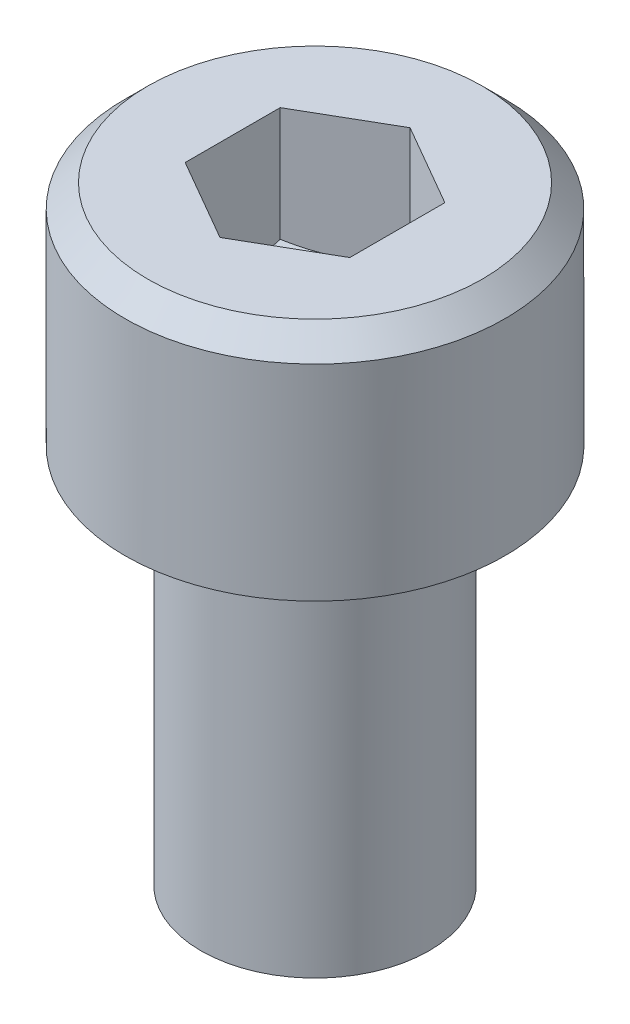
ISO-10303-21;
HEADER;
FILE_DESCRIPTION(('STEP AP214'),'2;1');
FILE_NAME('part.step','',(''),(''),'','','');
FILE_SCHEMA(('AUTOMOTIVE_DESIGN { 1 0 10303 214 1 1 1 1 }'));
ENDSEC;
DATA;
#1=APPLICATION_CONTEXT('core data for automotive mechanical design processes');
#2=APPLICATION_PROTOCOL_DEFINITION('international standard','automotive_design',2000,#1);
#3=PRODUCT_CONTEXT('',#1,'mechanical');
#4=PRODUCT('Part','Part','',(#3));
#5=PRODUCT_RELATED_PRODUCT_CATEGORY('part','',(#4));
#6=PRODUCT_DEFINITION_FORMATION('','',#4);
#7=PRODUCT_DEFINITION_CONTEXT('part definition',#1,'design');
#8=PRODUCT_DEFINITION('design','',#6,#7);
#9=PRODUCT_DEFINITION_SHAPE('','',#8);
#10=(LENGTH_UNIT() NAMED_UNIT(*) SI_UNIT(.MILLI.,.METRE.));
#11=(NAMED_UNIT(*) PLANE_ANGLE_UNIT() SI_UNIT($,.RADIAN.));
#12=(NAMED_UNIT(*) SI_UNIT($,.STERADIAN.) SOLID_ANGLE_UNIT());
#13=UNCERTAINTY_MEASURE_WITH_UNIT(LENGTH_MEASURE(1.E-05),#10,'distance_accuracy_value','');
#14=(GEOMETRIC_REPRESENTATION_CONTEXT(3) GLOBAL_UNCERTAINTY_ASSIGNED_CONTEXT((#13)) GLOBAL_UNIT_ASSIGNED_CONTEXT((#10,
#11,#12)) REPRESENTATION_CONTEXT('',''));
#15=CARTESIAN_POINT('',(0.,0.,0.));
#16=DIRECTION('',(0.,0.,1.));
#17=DIRECTION('',(1.,0.,0.));
#18=AXIS2_PLACEMENT_3D('',#15,#16,#17);
#19=CARTESIAN_POINT('',(0.,0.,0.));
#20=DIRECTION('',(0.,1.,0.));
#21=DIRECTION('',(0.,0.,1.));
#22=AXIS2_PLACEMENT_3D('',#19,#20,#21);
#23=PLANE('',#22);
#24=CARTESIAN_POINT('',(0.,0.,0.));
#25=DIRECTION('',(0.,1.,0.));
#26=DIRECTION('',(0.,0.,1.));
#27=AXIS2_PLACEMENT_3D('',#24,#25,#26);
#28=CIRCLE('',#27,5.);
#29=CARTESIAN_POINT('',(0.,0.,5.));
#30=VERTEX_POINT('',#29);
#31=EDGE_CURVE('E192',#30,#30,#28,.T.);
#32=ORIENTED_EDGE('',*,*,#31,.F.);
#33=EDGE_LOOP('',(#32));
#34=FACE_BOUND('',#33,.T.);
#35=CARTESIAN_POINT('',(0.,0.,0.));
#36=DIRECTION('',(0.,1.,0.));
#37=DIRECTION('',(0.,0.,1.));
#38=AXIS2_PLACEMENT_3D('',#35,#36,#37);
#39=CIRCLE('',#38,3.);
#40=CARTESIAN_POINT('',(0.,0.,3.));
#41=VERTEX_POINT('',#40);
#42=EDGE_CURVE('E11',#41,#41,#39,.F.);
#43=ORIENTED_EDGE('',*,*,#42,.F.);
#44=EDGE_LOOP('',(#43));
#45=FACE_BOUND('',#44,.T.);
#46=ADVANCED_FACE('F32',(#34,#45),#23,.F.);
#47=CARTESIAN_POINT('',(0.,6.,0.));
#48=DIRECTION('',(0.,1.,0.));
#49=DIRECTION('',(0.,0.,1.));
#50=AXIS2_PLACEMENT_3D('',#47,#48,#49);
#51=PLANE('',#50);
#52=CARTESIAN_POINT('',(0.,6.,0.));
#53=DIRECTION('',(0.,1.,0.));
#54=DIRECTION('',(0.,0.,1.));
#55=AXIS2_PLACEMENT_3D('',#52,#53,#54);
#56=CIRCLE('',#55,4.4);
#57=CARTESIAN_POINT('',(0.,6.,-4.40000000000001));
#58=VERTEX_POINT('',#57);
#59=EDGE_CURVE('E105',#58,#58,#56,.T.);
#60=ORIENTED_EDGE('',*,*,#59,.T.);
#61=EDGE_LOOP('',(#60));
#62=FACE_BOUND('',#61,.T.);
#63=DIRECTION('',(-0.866025403784439,0.,0.5));
#64=VECTOR('',#63,1.);
#65=CARTESIAN_POINT('',(0.,6.,-2.5));
#66=LINE('',#65,#64);
#67=CARTESIAN_POINT('',(0.,6.,-2.5));
#68=VERTEX_POINT('',#67);
#69=CARTESIAN_POINT('',(-2.1650635094611,6.,-1.25));
#70=VERTEX_POINT('',#69);
#71=EDGE_CURVE('E168',#68,#70,#66,.T.);
#72=ORIENTED_EDGE('',*,*,#71,.F.);
#73=DIRECTION('',(-0.866025403784439,0.,-0.5));
#74=VECTOR('',#73,1.);
#75=CARTESIAN_POINT('',(2.1650635094611,6.,-1.25));
#76=LINE('',#75,#74);
#77=CARTESIAN_POINT('',(2.1650635094611,6.,-1.25));
#78=VERTEX_POINT('',#77);
#79=EDGE_CURVE('E166',#78,#68,#76,.T.);
#80=ORIENTED_EDGE('',*,*,#79,.F.);
#81=DIRECTION('',(0.,0.,-1.));
#82=VECTOR('',#81,1.);
#83=CARTESIAN_POINT('',(2.1650635094611,6.,1.25));
#84=LINE('',#83,#82);
#85=CARTESIAN_POINT('',(2.1650635094611,6.,1.25));
#86=VERTEX_POINT('',#85);
#87=EDGE_CURVE('E177',#86,#78,#84,.T.);
#88=ORIENTED_EDGE('',*,*,#87,.F.);
#89=DIRECTION('',(0.866025403784439,0.,-0.5));
#90=VECTOR('',#89,1.);
#91=CARTESIAN_POINT('',(0.,6.,2.5));
#92=LINE('',#91,#90);
#93=CARTESIAN_POINT('',(0.,6.,2.5));
#94=VERTEX_POINT('',#93);
#95=EDGE_CURVE('E174',#94,#86,#92,.T.);
#96=ORIENTED_EDGE('',*,*,#95,.F.);
#97=DIRECTION('',(0.866025403784439,0.,0.5));
#98=VECTOR('',#97,1.);
#99=CARTESIAN_POINT('',(-2.1650635094611,6.,1.25));
#100=LINE('',#99,#98);
#101=CARTESIAN_POINT('',(-2.1650635094611,6.,1.25));
#102=VERTEX_POINT('',#101);
#103=EDGE_CURVE('E172',#102,#94,#100,.T.);
#104=ORIENTED_EDGE('',*,*,#103,.F.);
#105=DIRECTION('',(0.,0.,1.));
#106=VECTOR('',#105,1.);
#107=CARTESIAN_POINT('',(-2.1650635094611,6.,-1.25));
#108=LINE('',#107,#106);
#109=EDGE_CURVE('E170',#70,#102,#108,.T.);
#110=ORIENTED_EDGE('',*,*,#109,.F.);
#111=EDGE_LOOP('',(#72,#80,#88,#96,#104,#110));
#112=FACE_BOUND('',#111,.T.);
#113=ADVANCED_FACE('F160',(#62,#112),#51,.T.);
#114=CARTESIAN_POINT('',(0.,6.,0.));
#115=DIRECTION('',(0.,-1.,0.));
#116=DIRECTION('',(0.,0.,-1.));
#117=AXIS2_PLACEMENT_3D('',#114,#115,#116);
#118=CYLINDRICAL_SURFACE('',#117,5.);
#119=CARTESIAN_POINT('',(0.,5.4,0.));
#120=DIRECTION('',(0.,1.,0.));
#121=DIRECTION('',(0.,0.,1.));
#122=AXIS2_PLACEMENT_3D('',#119,#120,#121);
#123=CIRCLE('',#122,5.);
#124=CARTESIAN_POINT('',(0.,5.4,-5.));
#125=VERTEX_POINT('',#124);
#126=EDGE_CURVE('E103',#125,#125,#123,.F.);
#127=ORIENTED_EDGE('',*,*,#126,.T.);
#128=EDGE_LOOP('',(#127));
#129=FACE_BOUND('',#128,.T.);
#130=ORIENTED_EDGE('',*,*,#31,.T.);
#131=EDGE_LOOP('',(#130));
#132=FACE_BOUND('',#131,.T.);
#133=ADVANCED_FACE('F158',(#129,#132),#118,.T.);
#134=CARTESIAN_POINT('',(2.1650635094611,6.,-1.25));
#135=DIRECTION('',(-0.5,0.,0.866025403784439));
#136=DIRECTION('',(0.866025403784439,0.,0.5));
#137=AXIS2_PLACEMENT_3D('',#134,#135,#136);
#138=PLANE('',#137);
#139=CARTESIAN_POINT('',(2.1652635094611,3.00006667128526,-1.24988452994616));
#140=CARTESIAN_POINT('',(2.07011870500222,2.96833819267824,-1.30481640841249));
#141=CARTESIAN_POINT('',(1.97415261940043,2.93948196564871,-1.36022245376776));
#142=CARTESIAN_POINT('',(1.78055858450361,2.8891123686044,-1.47199402192894));
#143=CARTESIAN_POINT('',(1.68292719449887,2.86761681881919,-1.52836153122954));
#144=CARTESIAN_POINT('',(1.48887441273171,2.83415481969107,-1.6403979570198));
#145=CARTESIAN_POINT('',(1.39248288385733,2.82196568075938,-1.69604963216302));
#146=CARTESIAN_POINT('',(1.19924611203503,2.80741257411463,-1.80761493439196));
#147=CARTESIAN_POINT('',(1.10240157177295,2.80503655708809,-1.86352815578182));
#148=CARTESIAN_POINT('',(0.921431576568005,2.80997108906003,-1.96801123122864));
#149=CARTESIAN_POINT('',(0.83727907486481,2.81607004054281,-2.01659670073996));
#150=CARTESIAN_POINT('',(0.66952234238787,2.83540274952048,-2.11345109539389));
#151=CARTESIAN_POINT('',(0.58591869214993,2.84864311547626,-2.161719685364));
#152=CARTESIAN_POINT('',(0.417815884530456,2.88174403391763,-2.25877388659464));
#153=CARTESIAN_POINT('',(0.333338010712378,2.9017449447364,-2.30754720978407));
#154=CARTESIAN_POINT('',(0.165642462406327,2.9471395415079,-2.40436627974047));
#155=CARTESIAN_POINT('',(0.0824226383405094,2.97252255652845,-2.45241326756679));
#156=CARTESIAN_POINT('',(-0.00020000000000011,3.00006667128526,-2.50011547005384));
#157=B_SPLINE_CURVE_WITH_KNOTS('',3,(#139,#140,#141,#142,#143,#144,#145,#146,#147,#148,#149,
#150,#151,#152,#153,#154,#155,#156),.UNSPECIFIED.,.F.,.F.,(4,2,2,2,2,2,2,2,4),(0.,
0.343195712322223,0.687216523785883,1.02272234384043,1.3578160810825,1.64962474967976,
1.94170391412719,2.24026314832885,2.5382358827389),.UNSPECIFIED.);
#158=CARTESIAN_POINT('',(2.1650635094611,3.,-1.25));
#159=VERTEX_POINT('',#158);
#160=CARTESIAN_POINT('',(0.,3.,-2.5));
#161=VERTEX_POINT('',#160);
#162=EDGE_CURVE('E98',#159,#161,#157,.T.);
#163=ORIENTED_EDGE('',*,*,#162,.F.);
#164=DIRECTION('',(0.,-1.,0.));
#165=VECTOR('',#164,1.);
#166=CARTESIAN_POINT('',(2.1650635094611,6.,-1.25));
#167=LINE('',#166,#165);
#168=EDGE_CURVE('E179',#78,#159,#167,.T.);
#169=ORIENTED_EDGE('',*,*,#168,.F.);
#170=ORIENTED_EDGE('',*,*,#79,.T.);
#171=DIRECTION('',(0.,-1.,0.));
#172=VECTOR('',#171,1.);
#173=CARTESIAN_POINT('',(0.,6.,-2.5));
#174=LINE('',#173,#172);
#175=EDGE_CURVE('E190',#68,#161,#174,.T.);
#176=ORIENTED_EDGE('',*,*,#175,.T.);
#177=EDGE_LOOP('',(#163,#169,#170,#176));
#178=FACE_BOUND('',#177,.T.);
#179=ADVANCED_FACE('F154',(#178),#138,.T.);
#180=CARTESIAN_POINT('',(0.,6.,-2.5));
#181=DIRECTION('',(0.5,0.,0.866025403784439));
#182=DIRECTION('',(0.866025403784439,0.,-0.5));
#183=AXIS2_PLACEMENT_3D('',#180,#181,#182);
#184=PLANE('',#183);
#185=CARTESIAN_POINT('',(0.000199999999999844,3.00006667128526,-2.50011547005384));
#186=CARTESIAN_POINT('',(-0.0949448044588715,2.96833819267824,-2.44518359158751));
#187=CARTESIAN_POINT('',(-0.19091089006067,2.93948196564871,-2.38977754623224));
#188=CARTESIAN_POINT('',(-0.384504924957483,2.8891123686044,-2.27800597807106));
#189=CARTESIAN_POINT('',(-0.482136314962227,2.86761681881919,-2.22163846877046));
#190=CARTESIAN_POINT('',(-0.676189096729385,2.83415481969107,-2.1096020429802));
#191=CARTESIAN_POINT('',(-0.772580625603762,2.82196568075938,-2.05395036783698));
#192=CARTESIAN_POINT('',(-0.965817397426061,2.80741257411463,-1.94238506560804));
#193=CARTESIAN_POINT('',(-1.06266193768815,2.80503655708809,-1.88647184421818));
#194=CARTESIAN_POINT('',(-1.24363193289309,2.80997108906003,-1.78198876877136));
#195=CARTESIAN_POINT('',(-1.32778443459629,2.81607004054281,-1.73340329926004));
#196=CARTESIAN_POINT('',(-1.49554116707323,2.83540274952048,-1.63654890460611));
#197=CARTESIAN_POINT('',(-1.57914481731117,2.84864311547626,-1.588280314636));
#198=CARTESIAN_POINT('',(-1.74724762493064,2.88174403391763,-1.49122611340536));
#199=CARTESIAN_POINT('',(-1.83172549874872,2.9017449447364,-1.44245279021593));
#200=CARTESIAN_POINT('',(-1.99942104705477,2.9471395415079,-1.34563372025953));
#201=CARTESIAN_POINT('',(-2.08264087112059,2.97252255652845,-1.29758673243321));
#202=CARTESIAN_POINT('',(-2.1652635094611,3.00006667128526,-1.24988452994616));
#203=B_SPLINE_CURVE_WITH_KNOTS('',3,(#185,#186,#187,#188,#189,#190,#191,#192,#193,#194,#195,
#196,#197,#198,#199,#200,#201,#202),.UNSPECIFIED.,.F.,.F.,(4,2,2,2,2,2,2,2,4),(0.,
0.343195712322224,0.687216523785883,1.02272234384043,1.3578160810825,1.64962474967976,
1.94170391412719,2.24026314832885,2.5382358827389),.UNSPECIFIED.);
#204=CARTESIAN_POINT('',(-2.1650635094611,3.,-1.25));
#205=VERTEX_POINT('',#204);
#206=EDGE_CURVE('E47',#161,#205,#203,.T.);
#207=ORIENTED_EDGE('',*,*,#206,.F.);
#208=ORIENTED_EDGE('',*,*,#175,.F.);
#209=ORIENTED_EDGE('',*,*,#71,.T.);
#210=DIRECTION('',(0.,-1.,0.));
#211=VECTOR('',#210,1.);
#212=CARTESIAN_POINT('',(-2.1650635094611,6.,-1.25));
#213=LINE('',#212,#211);
#214=EDGE_CURVE('E188',#70,#205,#213,.T.);
#215=ORIENTED_EDGE('',*,*,#214,.T.);
#216=EDGE_LOOP('',(#207,#208,#209,#215));
#217=FACE_BOUND('',#216,.T.);
#218=ADVANCED_FACE('F150',(#217),#184,.T.);
#219=CARTESIAN_POINT('',(-2.1650635094611,6.,-1.25));
#220=DIRECTION('',(1.,0.,0.));
#221=DIRECTION('',(0.,0.,-1.));
#222=AXIS2_PLACEMENT_3D('',#219,#220,#221);
#223=PLANE('',#222);
#224=CARTESIAN_POINT('',(-2.1650635094611,3.8050470157385,-3.23708414492925));
#225=CARTESIAN_POINT('',(-2.1650635094611,3.76019170119658,-3.14358924619769));
#226=CARTESIAN_POINT('',(-2.1650635094611,3.71580228980288,-3.04986658111535));
#227=CARTESIAN_POINT('',(-2.1650635094611,3.62821957234331,-2.86184432477892));
#228=CARTESIAN_POINT('',(-2.1650635094611,3.58502648153564,-2.76754463337769));
#229=CARTESIAN_POINT('',(-2.1650635094611,3.49985940523741,-2.57770624397834));
#230=CARTESIAN_POINT('',(-2.1650635094611,3.45789440424991,-2.48216350004785));
#231=CARTESIAN_POINT('',(-2.1650635094611,3.37584621791638,-2.29027628003223));
#232=CARTESIAN_POINT('',(-2.1650635094611,3.33576293472415,-2.19393184594103));
#233=CARTESIAN_POINT('',(-2.1650635094611,3.2569585798419,-1.99775010772757));
#234=CARTESIAN_POINT('',(-2.1650635094611,3.21830052483963,-1.89788734084511));
#235=CARTESIAN_POINT('',(-2.1650635094611,3.14419847757395,-1.69695389064301));
#236=CARTESIAN_POINT('',(-2.1650635094611,3.10875485809403,-1.5958830687576));
#237=CARTESIAN_POINT('',(-2.1650635094611,3.04209525316469,-1.39260616192185));
#238=CARTESIAN_POINT('',(-2.1650635094611,3.01086949074224,-1.29040331799011));
#239=CARTESIAN_POINT('',(-2.1650635094611,2.95371347361438,-1.08453290243394));
#240=CARTESIAN_POINT('',(-2.1650635094611,2.92778190373159,-0.980865701441996));
#241=CARTESIAN_POINT('',(-2.1650635094611,2.88259661913837,-0.772282519162552));
#242=CARTESIAN_POINT('',(-2.1650635094611,2.86332918899182,-0.667369567919644));
#243=CARTESIAN_POINT('',(-2.1650635094611,2.83273384836688,-0.45636991372647));
#244=CARTESIAN_POINT('',(-2.1650635094611,2.82140540135738,-0.350283290587421));
#245=CARTESIAN_POINT('',(-2.1650635094611,2.807739084969,-0.138794772024842));
#246=CARTESIAN_POINT('',(-2.1650635094611,2.80529512070882,-0.033399902060047));
#247=CARTESIAN_POINT('',(-2.1650635094611,2.8093321989404,0.177225094551277));
#248=CARTESIAN_POINT('',(-2.1650635094611,2.81581379406952,0.282455210592975));
#249=CARTESIAN_POINT('',(-2.1650635094611,2.83432814879285,0.464666370273275));
#250=CARTESIAN_POINT('',(-2.1650635094611,2.84446946396863,0.54184888113423));
#251=CARTESIAN_POINT('',(-2.1650635094611,2.86885622129278,0.695568470988226));
#252=CARTESIAN_POINT('',(-2.1650635094611,2.88310237358499,0.77210543594052));
#253=CARTESIAN_POINT('',(-2.1650635094611,2.9312446294425,1.00070856673805));
#254=CARTESIAN_POINT('',(-2.1650635094611,2.97053094175,1.15164790005744));
#255=CARTESIAN_POINT('',(-2.1650635094611,3.03764968374044,1.37734752229313));
#256=CARTESIAN_POINT('',(-2.1650635094611,3.06170057056914,1.45329756023634));
#257=CARTESIAN_POINT('',(-2.1650635094611,3.11202648600941,1.6044114117336));
#258=CARTESIAN_POINT('',(-2.1650635094611,3.13830012658181,1.6795756834982));
#259=CARTESIAN_POINT('',(-2.1650635094611,3.19269084911368,1.82921284791554));
#260=CARTESIAN_POINT('',(-2.1650635094611,3.22080759605596,1.90368586342235));
#261=CARTESIAN_POINT('',(-2.1650635094611,3.27857997694148,2.05204546399224));
#262=CARTESIAN_POINT('',(-2.1650635094611,3.30823587088568,2.12593194752876));
#263=CARTESIAN_POINT('',(-2.1650635094611,3.38583420486507,2.31452960100078));
#264=CARTESIAN_POINT('',(-2.1650635094611,3.43469265937545,2.4288633910483));
#265=CARTESIAN_POINT('',(-2.1650635094611,3.53476008521725,2.65650089899962));
#266=CARTESIAN_POINT('',(-2.1650635094611,3.58596923263417,2.76980453897289));
#267=CARTESIAN_POINT('',(-2.1650635094611,3.69020422865822,2.99559474057868));
#268=CARTESIAN_POINT('',(-2.1650635094611,3.74323039241037,3.10808115632852));
#269=CARTESIAN_POINT('',(-2.1650635094611,3.85069884055655,3.33237654093382));
#270=CARTESIAN_POINT('',(-2.1650635094611,3.90514115644306,3.44418549465555));
#271=CARTESIAN_POINT('',(-2.1650635094611,4.07026614546233,3.77905713863866));
#272=CARTESIAN_POINT('',(-2.1650635094611,4.1826204263763,4.00129477654562));
#273=CARTESIAN_POINT('',(-2.1650635094611,4.41020240940515,4.4442484067733));
#274=CARTESIAN_POINT('',(-2.1650635094611,4.5254297462725,4.6649645880066));
#275=CARTESIAN_POINT('',(-2.1650635094611,4.74690853801413,5.08455999937498));
#276=CARTESIAN_POINT('',(-2.1650635094611,4.85298066526274,5.28353403787829));
#277=CARTESIAN_POINT('',(-2.1650635094611,5.06633256058658,5.68084213525983));
#278=CARTESIAN_POINT('',(-2.1650635094611,5.17361237335311,5.8791761701025));
#279=CARTESIAN_POINT('',(-2.1650635094611,5.38880369894564,6.27484726366277));
#280=CARTESIAN_POINT('',(-2.1650635094611,5.49671291098079,6.4721855750882));
#281=CARTESIAN_POINT('',(-2.1650635094611,5.7132336678127,6.86646322697264));
#282=CARTESIAN_POINT('',(-2.1650635094611,5.82184517555931,7.06340258777024));
#283=CARTESIAN_POINT('',(-2.1650635094611,5.93071410034849,7.26019862230059));
#284=B_SPLINE_CURVE_WITH_KNOTS('',3,(#224,#225,#226,#227,#228,#229,#230,#231,#232,#233,#234,
#235,#236,#237,#238,#239,#240,#241,#242,#243,#244,#245,#246,#247,#248,#249,#250,#251,#252,#253,
#254,#255,#256,#257,#258,#259,#260,#261,#262,#263,#264,#265,#266,#267,#268,#269,#270,#271,#272,
#273,#274,#275,#276,#277,#278,#279,#280,#281,#282,#283),.UNSPECIFIED.,.F.,.F.,(4,2,2,2,2,2,2,2,
2,2,2,2,2,2,2,2,2,2,2,2,2,2,2,2,2,2,2,2,2,4),(0.,0.311098713251637,0.622253044654453,
0.935294849275752,1.24832035817144,1.5695301269944,1.89077709954666,2.21126615366055,
2.53167549510638,2.85142142389698,3.17114574158382,3.48703926234269,3.80295234292973,
4.03637471213289,4.26983748807656,4.73712097600417,4.97610553629175,5.21494194459027,
5.45373505988453,5.69256864552432,6.06553756646348,6.43853447146568,6.81159640015035,
7.18466663211541,7.93170086903874,8.67864061595761,9.35507985472366,10.0315442084563,
10.7062879598375,11.3809964003824),.UNSPECIFIED.);
#285=CARTESIAN_POINT('',(-2.1650635094611,3.,1.25));
#286=VERTEX_POINT('',#285);
#287=EDGE_CURVE('E55',#205,#286,#284,.T.);
#288=ORIENTED_EDGE('',*,*,#287,.F.);
#289=ORIENTED_EDGE('',*,*,#214,.F.);
#290=ORIENTED_EDGE('',*,*,#109,.T.);
#291=DIRECTION('',(0.,-1.,0.));
#292=VECTOR('',#291,1.);
#293=CARTESIAN_POINT('',(-2.1650635094611,6.,1.25));
#294=LINE('',#293,#292);
#295=EDGE_CURVE('E186',#102,#286,#294,.T.);
#296=ORIENTED_EDGE('',*,*,#295,.T.);
#297=EDGE_LOOP('',(#288,#289,#290,#296));
#298=FACE_BOUND('',#297,.T.);
#299=ADVANCED_FACE('F147',(#298),#223,.T.);
#300=CARTESIAN_POINT('',(-2.1650635094611,6.,1.25));
#301=DIRECTION('',(0.5,0.,-0.866025403784439));
#302=DIRECTION('',(-0.866025403784439,0.,-0.5));
#303=AXIS2_PLACEMENT_3D('',#300,#301,#302);
#304=PLANE('',#303);
#305=CARTESIAN_POINT('',(-2.1652635094611,3.00006667128526,1.24988452994616));
#306=CARTESIAN_POINT('',(-2.07011870500222,2.96833819267824,1.30481640841249));
#307=CARTESIAN_POINT('',(-1.97415261940043,2.93948196564871,1.36022245376776));
#308=CARTESIAN_POINT('',(-1.78055858450361,2.8891123686044,1.47199402192894));
#309=CARTESIAN_POINT('',(-1.68292719449887,2.86761681881919,1.52836153122954));
#310=CARTESIAN_POINT('',(-1.48887441273171,2.83415481969107,1.6403979570198));
#311=CARTESIAN_POINT('',(-1.39248288385733,2.82196568075938,1.69604963216302));
#312=CARTESIAN_POINT('',(-1.19924611203504,2.80741257411463,1.80761493439196));
#313=CARTESIAN_POINT('',(-1.10240157177295,2.80503655708809,1.86352815578182));
#314=CARTESIAN_POINT('',(-0.921431576568005,2.80997108906003,1.96801123122864));
#315=CARTESIAN_POINT('',(-0.837279074864811,2.81607004054281,2.01659670073996));
#316=CARTESIAN_POINT('',(-0.669522342387871,2.83540274952048,2.11345109539389));
#317=CARTESIAN_POINT('',(-0.58591869214993,2.84864311547625,2.161719685364));
#318=CARTESIAN_POINT('',(-0.417815884530456,2.88174403391763,2.25877388659464));
#319=CARTESIAN_POINT('',(-0.333338010712378,2.9017449447364,2.30754720978407));
#320=CARTESIAN_POINT('',(-0.165642462406328,2.9471395415079,2.40436627974047));
#321=CARTESIAN_POINT('',(-0.0824226383405094,2.97252255652845,2.45241326756679));
#322=CARTESIAN_POINT('',(0.000199999999999981,3.00006667128526,2.50011547005384));
#323=B_SPLINE_CURVE_WITH_KNOTS('',3,(#305,#306,#307,#308,#309,#310,#311,#312,#313,#314,#315,
#316,#317,#318,#319,#320,#321,#322),.UNSPECIFIED.,.F.,.F.,(4,2,2,2,2,2,2,2,4),(0.,
0.343195712322224,0.687216523785883,1.02272234384044,1.3578160810825,1.64962474967976,
1.94170391412719,2.24026314832885,2.5382358827389),.UNSPECIFIED.);
#324=CARTESIAN_POINT('',(0.,3.,2.5));
#325=VERTEX_POINT('',#324);
#326=EDGE_CURVE('E132',#286,#325,#323,.T.);
#327=ORIENTED_EDGE('',*,*,#326,.F.);
#328=ORIENTED_EDGE('',*,*,#295,.F.);
#329=ORIENTED_EDGE('',*,*,#103,.T.);
#330=DIRECTION('',(0.,-1.,0.));
#331=VECTOR('',#330,1.);
#332=CARTESIAN_POINT('',(0.,6.,2.5));
#333=LINE('',#332,#331);
#334=EDGE_CURVE('E183',#94,#325,#333,.T.);
#335=ORIENTED_EDGE('',*,*,#334,.T.);
#336=EDGE_LOOP('',(#327,#328,#329,#335));
#337=FACE_BOUND('',#336,.T.);
#338=ADVANCED_FACE('F122',(#337),#304,.T.);
#339=CARTESIAN_POINT('',(0.,6.,2.5));
#340=DIRECTION('',(-0.5,0.,-0.866025403784439));
#341=DIRECTION('',(-0.866025403784439,0.,0.5));
#342=AXIS2_PLACEMENT_3D('',#339,#340,#341);
#343=PLANE('',#342);
#344=CARTESIAN_POINT('',(-0.000200000000000197,3.00006667128526,2.50011547005384));
#345=CARTESIAN_POINT('',(0.0949448044588709,2.96833819267824,2.44518359158751));
#346=CARTESIAN_POINT('',(0.190910890060669,2.93948196564871,2.38977754623224));
#347=CARTESIAN_POINT('',(0.384504924957482,2.8891123686044,2.27800597807106));
#348=CARTESIAN_POINT('',(0.482136314962227,2.86761681881919,2.22163846877046));
#349=CARTESIAN_POINT('',(0.676189096729384,2.83415481969107,2.1096020429802));
#350=CARTESIAN_POINT('',(0.772580625603762,2.82196568075938,2.05395036783698));
#351=CARTESIAN_POINT('',(0.965817397426061,2.80741257411463,1.94238506560804));
#352=CARTESIAN_POINT('',(1.06266193768815,2.80503655708809,1.88647184421818));
#353=CARTESIAN_POINT('',(1.24363193289309,2.80997108906003,1.78198876877136));
#354=CARTESIAN_POINT('',(1.32778443459629,2.81607004054281,1.73340329926004));
#355=CARTESIAN_POINT('',(1.49554116707323,2.83540274952048,1.63654890460611));
#356=CARTESIAN_POINT('',(1.57914481731117,2.84864311547626,1.588280314636));
#357=CARTESIAN_POINT('',(1.74724762493064,2.88174403391763,1.49122611340536));
#358=CARTESIAN_POINT('',(1.83172549874872,2.9017449447364,1.44245279021593));
#359=CARTESIAN_POINT('',(1.99942104705477,2.9471395415079,1.34563372025953));
#360=CARTESIAN_POINT('',(2.08264087112059,2.97252255652845,1.29758673243321));
#361=CARTESIAN_POINT('',(2.1652635094611,3.00006667128526,1.24988452994616));
#362=B_SPLINE_CURVE_WITH_KNOTS('',3,(#344,#345,#346,#347,#348,#349,#350,#351,#352,#353,#354,
#355,#356,#357,#358,#359,#360,#361),.UNSPECIFIED.,.F.,.F.,(4,2,2,2,2,2,2,2,4),(0.,
0.343195712322224,0.687216523785883,1.02272234384044,1.3578160810825,1.64962474967976,
1.94170391412719,2.24026314832885,2.5382358827389),.UNSPECIFIED.);
#363=CARTESIAN_POINT('',(2.1650635094611,3.,1.25));
#364=VERTEX_POINT('',#363);
#365=EDGE_CURVE('E100',#325,#364,#362,.T.);
#366=ORIENTED_EDGE('',*,*,#365,.F.);
#367=ORIENTED_EDGE('',*,*,#334,.F.);
#368=ORIENTED_EDGE('',*,*,#95,.T.);
#369=DIRECTION('',(0.,-1.,0.));
#370=VECTOR('',#369,1.);
#371=CARTESIAN_POINT('',(2.1650635094611,6.,1.25));
#372=LINE('',#371,#370);
#373=EDGE_CURVE('E181',#86,#364,#372,.T.);
#374=ORIENTED_EDGE('',*,*,#373,.T.);
#375=EDGE_LOOP('',(#366,#367,#368,#374));
#376=FACE_BOUND('',#375,.T.);
#377=ADVANCED_FACE('F118',(#376),#343,.T.);
#378=CARTESIAN_POINT('',(2.1650635094611,6.,1.25));
#379=DIRECTION('',(-1.,0.,0.));
#380=DIRECTION('',(0.,0.,1.));
#381=AXIS2_PLACEMENT_3D('',#378,#379,#380);
#382=PLANE('',#381);
#383=CARTESIAN_POINT('',(2.1650635094611,3.80504701517975,-3.23708414376496));
#384=CARTESIAN_POINT('',(2.1650635094611,3.7601917006619,-3.14358924507318));
#385=CARTESIAN_POINT('',(2.1650635094611,3.71580228929226,-3.04986658003067));
#386=CARTESIAN_POINT('',(2.1650635094611,3.62821957188067,-2.86184432377402));
#387=CARTESIAN_POINT('',(2.1650635094611,3.58502648109692,-2.76754463241276));
#388=CARTESIAN_POINT('',(2.1650635094611,3.49985940484656,-2.5777062430941));
#389=CARTESIAN_POINT('',(2.1650635094611,3.45789440388301,-2.48216349920434));
#390=CARTESIAN_POINT('',(2.1650635094611,3.37584621759691,-2.2902762792705));
#391=CARTESIAN_POINT('',(2.1650635094611,3.33576293442815,-2.19393184522035));
#392=CARTESIAN_POINT('',(2.1650635094611,3.25695857959301,-1.99775010709137));
#393=CARTESIAN_POINT('',(2.1650635094611,3.21830052461434,-1.89788734025237));
#394=CARTESIAN_POINT('',(2.1650635094611,3.14419847739439,-1.69695389013796));
#395=CARTESIAN_POINT('',(2.1650635094611,3.10875485793662,-1.59588306829678));
#396=CARTESIAN_POINT('',(2.1650635094611,3.04209525304914,-1.39260616155032));
#397=CARTESIAN_POINT('',(2.1650635094611,3.0108694906464,-1.29040331766364));
#398=CARTESIAN_POINT('',(2.1650635094611,2.95371347355431,-1.08453290219886));
#399=CARTESIAN_POINT('',(2.1650635094611,2.92778190368756,-0.980865701253249));
#400=CARTESIAN_POINT('',(2.1650635094611,2.88259661912381,-0.772282519080866));
#401=CARTESIAN_POINT('',(2.1650635094611,2.86332918898986,-0.667369567898863));
#402=CARTESIAN_POINT('',(2.1650635094611,2.83273384838067,-0.456369913828776));
#403=CARTESIAN_POINT('',(2.1650635094611,2.82140540137432,-0.350283290751908));
#404=CARTESIAN_POINT('',(2.1650635094611,2.80773908498135,-0.138794772312532));
#405=CARTESIAN_POINT('',(2.1650635094611,2.8052951207136,-0.0333999024087556));
#406=CARTESIAN_POINT('',(2.1650635094611,2.80933219891993,0.177225094081675));
#407=CARTESIAN_POINT('',(2.1650635094611,2.81581379403136,0.282455210063497));
#408=CARTESIAN_POINT('',(2.1650635094611,2.83432814871952,0.464666369665743));
#409=CARTESIAN_POINT('',(2.1650635094611,2.84446946388102,0.541848880507875));
#410=CARTESIAN_POINT('',(2.1650635094611,2.86885622117581,0.695568470324979));
#411=CARTESIAN_POINT('',(2.1650635094611,2.88310237345295,0.772105435259202));
#412=CARTESIAN_POINT('',(2.1650635094611,2.93124462926483,1.00070856600332));
#413=CARTESIAN_POINT('',(2.1650635094611,2.97053094154144,1.1516478992883));
#414=CARTESIAN_POINT('',(2.1650635094611,3.03764968348607,1.3773475214724));
#415=CARTESIAN_POINT('',(2.1650635094611,3.06170057029937,1.45329755939808));
#416=CARTESIAN_POINT('',(2.1650635094611,3.11202648570923,1.60441141086046));
#417=CARTESIAN_POINT('',(2.1650635094611,3.13830012626662,1.6795756826077));
#418=CARTESIAN_POINT('',(2.1650635094611,3.19269084876891,1.82921284699041));
#419=CARTESIAN_POINT('',(2.1650635094611,3.22080759569662,1.90368586247996));
#420=CARTESIAN_POINT('',(2.1650635094611,3.27857997655341,2.05204546301529));
#421=CARTESIAN_POINT('',(2.1650635094611,3.30823587048345,2.12593194653453));
#422=CARTESIAN_POINT('',(2.1650635094611,3.38583420444056,2.3145295999951));
#423=CARTESIAN_POINT('',(2.1650635094611,3.43469265894398,2.42886339004804));
#424=CARTESIAN_POINT('',(2.1650635094611,3.53476008477379,2.65650089800953));
#425=CARTESIAN_POINT('',(2.1650635094611,3.58596923218569,2.76980453798755));
#426=CARTESIAN_POINT('',(2.1650635094611,3.6902042282011,2.99559473960234));
#427=CARTESIAN_POINT('',(2.1650635094611,3.74323039194965,3.10808115535644));
#428=CARTESIAN_POINT('',(2.1650635094611,3.85069884008964,3.33237653996981));
#429=CARTESIAN_POINT('',(2.1650635094611,3.90514115597357,3.44418549369536));
#430=CARTESIAN_POINT('',(2.1650635094611,4.0702661449864,3.7790571376898));
#431=CARTESIAN_POINT('',(2.1650635094611,4.18262042589765,4.00129477560376));
#432=CARTESIAN_POINT('',(2.1650635094611,4.41020240892275,4.44424840584453));
#433=CARTESIAN_POINT('',(2.1650635094611,4.52542974578907,4.66496458708394));
#434=CARTESIAN_POINT('',(2.1650635094611,4.74690853752681,5.08455999845788));
#435=CARTESIAN_POINT('',(2.1650635094611,4.85298066477242,5.28353403696071));
#436=CARTESIAN_POINT('',(2.1650635094611,5.06633256009079,5.68084213434104));
#437=CARTESIAN_POINT('',(2.1650635094611,5.17361237285485,5.87917616918298));
#438=CARTESIAN_POINT('',(2.1650635094611,5.38880369844244,6.27484726274091));
#439=CARTESIAN_POINT('',(2.1650635094611,5.49671291047511,6.47218557416474));
#440=CARTESIAN_POINT('',(2.1650635094611,5.71323366730232,6.86646322604583));
#441=CARTESIAN_POINT('',(2.1650635094611,5.8218451750467,7.06340258684168));
#442=CARTESIAN_POINT('',(2.1650635094611,5.93071409983375,7.26019862137022));
#443=B_SPLINE_CURVE_WITH_KNOTS('',3,(#383,#384,#385,#386,#387,#388,#389,#390,#391,#392,#393,
#394,#395,#396,#397,#398,#399,#400,#401,#402,#403,#404,#405,#406,#407,#408,#409,#410,#411,#412,
#413,#414,#415,#416,#417,#418,#419,#420,#421,#422,#423,#424,#425,#426,#427,#428,#429,#430,#431,
#432,#433,#434,#435,#436,#437,#438,#439,#440,#441,#442),.UNSPECIFIED.,.F.,.F.,(4,2,2,2,2,2,2,2,
2,2,2,2,2,2,2,2,2,2,2,2,2,2,2,2,2,2,2,2,2,4),(0.,0.311098713112778,0.622253044376707,
0.935294848857242,1.24832035761218,1.56953012628802,1.89077709869312,2.21126615266055,
2.53167549396003,2.85142142256452,3.17114574006551,3.48703926064258,3.80295234104766,
4.03637471018926,4.26983748607137,4.73712097387555,4.97610553409904,5.21494194233353,
5.45373505756386,5.69256864313972,6.06553756408557,6.43853446909451,6.81159639778609,
7.18466662975807,7.93170086669639,8.67864061363007,9.35507985239061,10.0315442061178,
10.7062879574912,11.3809963980282),.UNSPECIFIED.);
#444=EDGE_CURVE('E40',#364,#159,#443,.F.);
#445=ORIENTED_EDGE('',*,*,#444,.F.);
#446=ORIENTED_EDGE('',*,*,#373,.F.);
#447=ORIENTED_EDGE('',*,*,#87,.T.);
#448=ORIENTED_EDGE('',*,*,#168,.T.);
#449=EDGE_LOOP('',(#445,#446,#447,#448));
#450=FACE_BOUND('',#449,.T.);
#451=ADVANCED_FACE('F114',(#450),#382,.T.);
#452=CARTESIAN_POINT('',(0.,6.,0.));
#453=DIRECTION('',(0.,-1.,0.));
#454=DIRECTION('',(0.,0.,-1.));
#455=AXIS2_PLACEMENT_3D('',#452,#453,#454);
#456=CONICAL_SURFACE('',#455,4.4,0.785398163397447);
#457=CARTESIAN_POINT('',(0.,5.4,-5.));
#458=CARTESIAN_POINT('',(0.,5.40625,-4.99375));
#459=CARTESIAN_POINT('',(0.,5.4125,-4.9875));
#460=CARTESIAN_POINT('',(0.,5.425,-4.975));
#461=CARTESIAN_POINT('',(0.,5.43125,-4.96875));
#462=CARTESIAN_POINT('',(0.,5.44375,-4.95625));
#463=CARTESIAN_POINT('',(0.,5.45,-4.95));
#464=CARTESIAN_POINT('',(0.,5.4625,-4.9375));
#465=CARTESIAN_POINT('',(0.,5.46875,-4.93125));
#466=CARTESIAN_POINT('',(0.,5.48125,-4.91875));
#467=CARTESIAN_POINT('',(0.,5.4875,-4.9125));
#468=CARTESIAN_POINT('',(0.,5.5,-4.9));
#469=CARTESIAN_POINT('',(0.,5.50625,-4.89375));
#470=CARTESIAN_POINT('',(0.,5.51875,-4.88125));
#471=CARTESIAN_POINT('',(0.,5.525,-4.875));
#472=CARTESIAN_POINT('',(0.,5.5375,-4.8625));
#473=CARTESIAN_POINT('',(0.,5.54375,-4.85625));
#474=CARTESIAN_POINT('',(0.,5.55625,-4.84375));
#475=CARTESIAN_POINT('',(0.,5.5625,-4.8375));
#476=CARTESIAN_POINT('',(0.,5.575,-4.825));
#477=CARTESIAN_POINT('',(0.,5.58125,-4.81875));
#478=CARTESIAN_POINT('',(0.,5.59375,-4.80625));
#479=CARTESIAN_POINT('',(0.,5.6,-4.8));
#480=CARTESIAN_POINT('',(0.,5.6125,-4.7875));
#481=CARTESIAN_POINT('',(0.,5.61875,-4.78125));
#482=CARTESIAN_POINT('',(0.,5.63125,-4.76875));
#483=CARTESIAN_POINT('',(0.,5.6375,-4.7625));
#484=CARTESIAN_POINT('',(0.,5.65,-4.75));
#485=CARTESIAN_POINT('',(0.,5.65625,-4.74375));
#486=CARTESIAN_POINT('',(0.,5.66875,-4.73125));
#487=CARTESIAN_POINT('',(0.,5.675,-4.725));
#488=CARTESIAN_POINT('',(0.,5.6875,-4.7125));
#489=CARTESIAN_POINT('',(0.,5.69375,-4.70625));
#490=CARTESIAN_POINT('',(0.,5.70625,-4.69375));
#491=CARTESIAN_POINT('',(0.,5.7125,-4.6875));
#492=CARTESIAN_POINT('',(0.,5.725,-4.675));
#493=CARTESIAN_POINT('',(0.,5.73125,-4.66875));
#494=CARTESIAN_POINT('',(0.,5.74375,-4.65625));
#495=CARTESIAN_POINT('',(0.,5.75,-4.65));
#496=CARTESIAN_POINT('',(0.,5.7625,-4.6375));
#497=CARTESIAN_POINT('',(0.,5.76875,-4.63125));
#498=CARTESIAN_POINT('',(0.,5.78125,-4.61875));
#499=CARTESIAN_POINT('',(0.,5.7875,-4.6125));
#500=CARTESIAN_POINT('',(0.,5.8,-4.6));
#501=CARTESIAN_POINT('',(0.,5.80625,-4.59375));
#502=CARTESIAN_POINT('',(0.,5.81875,-4.58125));
#503=CARTESIAN_POINT('',(0.,5.825,-4.575));
#504=CARTESIAN_POINT('',(0.,5.8375,-4.5625));
#505=CARTESIAN_POINT('',(0.,5.84375,-4.55625));
#506=CARTESIAN_POINT('',(0.,5.85625,-4.54375));
#507=CARTESIAN_POINT('',(0.,5.8625,-4.5375));
#508=CARTESIAN_POINT('',(0.,5.875,-4.525));
#509=CARTESIAN_POINT('',(0.,5.88125,-4.51875));
#510=CARTESIAN_POINT('',(0.,5.89375,-4.50625));
#511=CARTESIAN_POINT('',(0.,5.9,-4.5));
#512=CARTESIAN_POINT('',(0.,5.9125,-4.4875));
#513=CARTESIAN_POINT('',(0.,5.91875,-4.48125));
#514=CARTESIAN_POINT('',(0.,5.93125,-4.46875));
#515=CARTESIAN_POINT('',(0.,5.9375,-4.4625));
#516=CARTESIAN_POINT('',(0.,5.95,-4.45));
#517=CARTESIAN_POINT('',(0.,5.95625,-4.44375));
#518=CARTESIAN_POINT('',(0.,5.96875,-4.43125));
#519=CARTESIAN_POINT('',(0.,5.975,-4.42500000000001));
#520=CARTESIAN_POINT('',(0.,5.9875,-4.4125));
#521=CARTESIAN_POINT('',(0.,5.99375,-4.40625));
#522=CARTESIAN_POINT('',(0.,6.,-4.4));
#523=B_SPLINE_CURVE_WITH_KNOTS('',3,(#457,#458,#459,#460,#461,#462,#463,#464,#465,#466,#467,
#468,#469,#470,#471,#472,#473,#474,#475,#476,#477,#478,#479,#480,#481,#482,#483,#484,#485,#486,
#487,#488,#489,#490,#491,#492,#493,#494,#495,#496,#497,#498,#499,#500,#501,#502,#503,#504,#505,
#506,#507,#508,#509,#510,#511,#512,#513,#514,#515,#516,#517,#518,#519,#520,#521,#522),
.UNSPECIFIED.,.F.,.F.,(4,2,2,2,2,2,2,2,2,2,2,2,2,2,2,2,2,2,2,2,2,2,2,2,2,2,2,2,2,2,2,2,4),(0.,
0.0265165042944951,0.0530330085889901,0.0795495128834858,0.106066017177981,0.132582521472477,
0.159099025766972,0.185615530061467,0.212132034355962,0.238648538650457,0.265165042944953,
0.291681547239449,0.318198051533944,0.344714555828439,0.371231060122935,0.39774756441743,
0.424264068711925,0.45078057300642,0.477297077300916,0.503813581595412,0.530330085889907,
0.556846590184402,0.583363094478898,0.609879598773393,0.636396103067888,0.662912607362384,
0.689429111656879,0.715945615951374,0.74246212024587,0.768978624540365,0.79549512883486,
0.822011633129355,0.848528137423852),.UNSPECIFIED.);
#524=EDGE_CURVE('BSEAM34',#125,#58,#523,.T.);
#525=ORIENTED_EDGE('',*,*,#126,.F.);
#526=ORIENTED_EDGE('',*,*,#59,.F.);
#527=ORIENTED_EDGE('',*,*,#524,.T.);
#528=ORIENTED_EDGE('',*,*,#524,.F.);
#529=EDGE_LOOP('',(#525,#527,#526,#528));
#530=FACE_BOUND('',#529,.T.);
#531=ADVANCED_FACE('F34',(#530),#456,.T.);
#532=CARTESIAN_POINT('',(0.,3.,0.));
#533=DIRECTION('',(0.,1.,0.));
#534=DIRECTION('',(-1.,0.,0.));
#535=AXIS2_PLACEMENT_3D('',#532,#533,#534);
#536=CONICAL_SURFACE('',#535,2.5,1.0471975511966);
#537=CARTESIAN_POINT('',(0.,1.55662432702594,0.));
#538=VERTEX_POINT('',#537);
#539=VERTEX_LOOP('',#538);
#540=FACE_BOUND('',#539,.T.);
#541=ORIENTED_EDGE('',*,*,#444,.T.);
#542=ORIENTED_EDGE('',*,*,#162,.T.);
#543=ORIENTED_EDGE('',*,*,#206,.T.);
#544=ORIENTED_EDGE('',*,*,#287,.T.);
#545=ORIENTED_EDGE('',*,*,#326,.T.);
#546=ORIENTED_EDGE('',*,*,#365,.T.);
#547=EDGE_LOOP('',(#541,#542,#543,#544,#545,#546));
#548=FACE_BOUND('',#547,.T.);
#549=ADVANCED_FACE('F89',(#540,#548),#536,.F.);
#550=CARTESIAN_POINT('',(0.,-10.,0.));
#551=DIRECTION('',(0.,1.,0.));
#552=DIRECTION('',(0.,0.,1.));
#553=AXIS2_PLACEMENT_3D('',#550,#551,#552);
#554=CYLINDRICAL_SURFACE('',#553,3.);
#555=CARTESIAN_POINT('',(0.,-10.,0.));
#556=DIRECTION('',(0.,-1.,0.));
#557=DIRECTION('',(0.,0.,-1.));
#558=AXIS2_PLACEMENT_3D('',#555,#556,#557);
#559=CIRCLE('',#558,3.);
#560=CARTESIAN_POINT('',(0.,-10.,-3.));
#561=VERTEX_POINT('',#560);
#562=EDGE_CURVE('E133',#561,#561,#559,.T.);
#563=ORIENTED_EDGE('',*,*,#562,.F.);
#564=EDGE_LOOP('',(#563));
#565=FACE_BOUND('',#564,.T.);
#566=ORIENTED_EDGE('',*,*,#42,.T.);
#567=EDGE_LOOP('',(#566));
#568=FACE_BOUND('',#567,.T.);
#569=ADVANCED_FACE('F92',(#565,#568),#554,.T.);
#570=CARTESIAN_POINT('',(0.,-10.,0.));
#571=DIRECTION('',(0.,-1.,0.));
#572=DIRECTION('',(0.,0.,-1.));
#573=AXIS2_PLACEMENT_3D('',#570,#571,#572);
#574=PLANE('',#573);
#575=ORIENTED_EDGE('',*,*,#562,.T.);
#576=EDGE_LOOP('',(#575));
#577=FACE_BOUND('',#576,.T.);
#578=ADVANCED_FACE('F265',(#577),#574,.T.);
#579=CLOSED_SHELL('',(#46,#113,#133,#179,#218,#299,#338,#377,#451,#531,#549,#569,#578));
#580=MANIFOLD_SOLID_BREP('B2',#579);
#581=ADVANCED_BREP_SHAPE_REPRESENTATION('',(#18,#580),#14);
#582=SHAPE_DEFINITION_REPRESENTATION(#9,#581);
ENDSEC;
END-ISO-10303-21;
